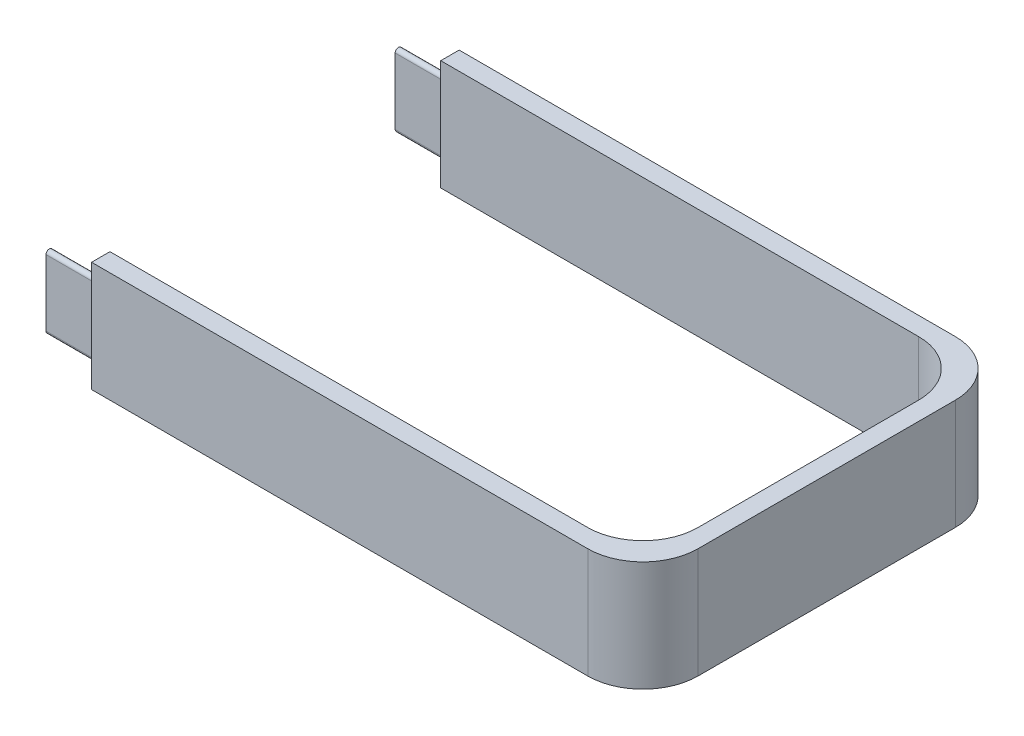
ISO-10303-21;
HEADER;
FILE_DESCRIPTION(('STEP AP214'),'2;1');
FILE_NAME('part.step','',(''),(''),'','','');
FILE_SCHEMA(('AUTOMOTIVE_DESIGN { 1 0 10303 214 1 1 1 1 }'));
ENDSEC;
DATA;
#1=APPLICATION_CONTEXT('core data for automotive mechanical design processes');
#2=APPLICATION_PROTOCOL_DEFINITION('international standard','automotive_design',2000,#1);
#3=PRODUCT_CONTEXT('',#1,'mechanical');
#4=PRODUCT('Part','Part','',(#3));
#5=PRODUCT_RELATED_PRODUCT_CATEGORY('part','',(#4));
#6=PRODUCT_DEFINITION_FORMATION('','',#4);
#7=PRODUCT_DEFINITION_CONTEXT('part definition',#1,'design');
#8=PRODUCT_DEFINITION('design','',#6,#7);
#9=PRODUCT_DEFINITION_SHAPE('','',#8);
#10=(LENGTH_UNIT() NAMED_UNIT(*) SI_UNIT(.MILLI.,.METRE.));
#11=(NAMED_UNIT(*) PLANE_ANGLE_UNIT() SI_UNIT($,.RADIAN.));
#12=(NAMED_UNIT(*) SI_UNIT($,.STERADIAN.) SOLID_ANGLE_UNIT());
#13=UNCERTAINTY_MEASURE_WITH_UNIT(LENGTH_MEASURE(1.E-05),#10,'distance_accuracy_value','');
#14=(GEOMETRIC_REPRESENTATION_CONTEXT(3) GLOBAL_UNCERTAINTY_ASSIGNED_CONTEXT((#13)) GLOBAL_UNIT_ASSIGNED_CONTEXT((#10,
#11,#12)) REPRESENTATION_CONTEXT('',''));
#15=CARTESIAN_POINT('',(0.,0.,0.));
#16=DIRECTION('',(0.,0.,1.));
#17=DIRECTION('',(1.,0.,0.));
#18=AXIS2_PLACEMENT_3D('',#15,#16,#17);
#19=CARTESIAN_POINT('',(2.5,30.,-97.5));
#20=DIRECTION('',(0.,-1.,0.));
#21=DIRECTION('',(0.,0.,-1.));
#22=AXIS2_PLACEMENT_3D('',#19,#20,#21);
#23=PLANE('',#22);
#24=DIRECTION('',(0.,0.,-1.));
#25=VECTOR('',#24,1.);
#26=CARTESIAN_POINT('',(170.,30.,-97.5));
#27=LINE('',#26,#25);
#28=CARTESIAN_POINT('',(170.,30.,0.));
#29=VERTEX_POINT('',#28);
#30=CARTESIAN_POINT('',(170.,30.,-5.));
#31=VERTEX_POINT('',#30);
#32=EDGE_CURVE('E310',#29,#31,#27,.T.);
#33=ORIENTED_EDGE('',*,*,#32,.F.);
#34=DIRECTION('',(1.,0.,0.));
#35=VECTOR('',#34,1.);
#36=CARTESIAN_POINT('',(0.,30.,0.));
#37=LINE('',#36,#35);
#38=CARTESIAN_POINT('',(305.,30.,0.));
#39=VERTEX_POINT('',#38);
#40=EDGE_CURVE('E398',#29,#39,#37,.T.);
#41=ORIENTED_EDGE('',*,*,#40,.T.);
#42=CARTESIAN_POINT('',(305.,30.,-15.));
#43=DIRECTION('',(0.,1.,0.));
#44=DIRECTION('',(0.,0.,1.));
#45=AXIS2_PLACEMENT_3D('',#42,#43,#44);
#46=CIRCLE('',#45,15.);
#47=CARTESIAN_POINT('',(320.,30.,-15.0000000000001));
#48=VERTEX_POINT('',#47);
#49=EDGE_CURVE('E401',#39,#48,#46,.T.);
#50=ORIENTED_EDGE('',*,*,#49,.T.);
#51=DIRECTION('',(0.,0.,-1.));
#52=VECTOR('',#51,1.);
#53=CARTESIAN_POINT('',(320.,30.,-15.0000000000001));
#54=LINE('',#53,#52);
#55=CARTESIAN_POINT('',(320.,30.,-84.9999999999999));
#56=VERTEX_POINT('',#55);
#57=EDGE_CURVE('E405',#48,#56,#54,.T.);
#58=ORIENTED_EDGE('',*,*,#57,.T.);
#59=CARTESIAN_POINT('',(305.,30.,-85.));
#60=DIRECTION('',(0.,1.,0.));
#61=DIRECTION('',(0.,0.,1.));
#62=AXIS2_PLACEMENT_3D('',#59,#60,#61);
#63=CIRCLE('',#62,15.);
#64=CARTESIAN_POINT('',(305.,30.,-100.));
#65=VERTEX_POINT('',#64);
#66=EDGE_CURVE('E408',#56,#65,#63,.T.);
#67=ORIENTED_EDGE('',*,*,#66,.T.);
#68=DIRECTION('',(-1.,0.,0.));
#69=VECTOR('',#68,1.);
#70=CARTESIAN_POINT('',(2.50000000000002,30.,-100.));
#71=LINE('',#70,#69);
#72=CARTESIAN_POINT('',(170.,30.,-100.));
#73=VERTEX_POINT('',#72);
#74=EDGE_CURVE('E411',#65,#73,#71,.T.);
#75=ORIENTED_EDGE('',*,*,#74,.T.);
#76=CARTESIAN_POINT('',(170.,30.,-95.));
#77=VERTEX_POINT('',#76);
#78=EDGE_CURVE('E306',#77,#73,#27,.T.);
#79=ORIENTED_EDGE('',*,*,#78,.F.);
#80=DIRECTION('',(-1.,0.,0.));
#81=VECTOR('',#80,1.);
#82=CARTESIAN_POINT('',(20.0000000000001,30.,-95.));
#83=LINE('',#82,#81);
#84=CARTESIAN_POINT('',(300.,30.,-95.));
#85=VERTEX_POINT('',#84);
#86=EDGE_CURVE('E361',#85,#77,#83,.T.);
#87=ORIENTED_EDGE('',*,*,#86,.F.);
#88=CARTESIAN_POINT('',(300.,30.,-80.));
#89=DIRECTION('',(0.,1.,0.));
#90=DIRECTION('',(0.,0.,-1.));
#91=AXIS2_PLACEMENT_3D('',#88,#89,#90);
#92=CIRCLE('',#91,15.);
#93=CARTESIAN_POINT('',(315.,30.,-79.9999999999999));
#94=VERTEX_POINT('',#93);
#95=EDGE_CURVE('E358',#94,#85,#92,.T.);
#96=ORIENTED_EDGE('',*,*,#95,.F.);
#97=DIRECTION('',(0.,0.,-1.));
#98=VECTOR('',#97,1.);
#99=CARTESIAN_POINT('',(315.,30.,-79.9999999999999));
#100=LINE('',#99,#98);
#101=CARTESIAN_POINT('',(315.,30.,-20.0000000000001));
#102=VERTEX_POINT('',#101);
#103=EDGE_CURVE('E355',#102,#94,#100,.T.);
#104=ORIENTED_EDGE('',*,*,#103,.F.);
#105=CARTESIAN_POINT('',(300.,30.,-20.));
#106=DIRECTION('',(0.,1.,0.));
#107=DIRECTION('',(0.,0.,-1.));
#108=AXIS2_PLACEMENT_3D('',#105,#106,#107);
#109=CIRCLE('',#108,15.);
#110=CARTESIAN_POINT('',(300.,30.,-5.));
#111=VERTEX_POINT('',#110);
#112=EDGE_CURVE('E351',#111,#102,#109,.T.);
#113=ORIENTED_EDGE('',*,*,#112,.F.);
#114=DIRECTION('',(1.,0.,0.));
#115=VECTOR('',#114,1.);
#116=CARTESIAN_POINT('',(20.0000000000001,30.,-5.));
#117=LINE('',#116,#115);
#118=EDGE_CURVE('E348',#31,#111,#117,.T.);
#119=ORIENTED_EDGE('',*,*,#118,.F.);
#120=EDGE_LOOP('',(#33,#41,#50,#58,#67,#75,#79,#87,#96,#104,#113,#119));
#121=FACE_BOUND('',#120,.T.);
#122=ADVANCED_FACE('F45',(#121),#23,.F.);
#123=CARTESIAN_POINT('',(2.5,0.,-97.5));
#124=DIRECTION('',(0.,-1.,0.));
#125=DIRECTION('',(0.,0.,-1.));
#126=AXIS2_PLACEMENT_3D('',#123,#124,#125);
#127=PLANE('',#126);
#128=DIRECTION('',(1.,0.,0.));
#129=VECTOR('',#128,1.);
#130=CARTESIAN_POINT('',(0.,0.,0.));
#131=LINE('',#130,#129);
#132=CARTESIAN_POINT('',(170.,0.,0.));
#133=VERTEX_POINT('',#132);
#134=CARTESIAN_POINT('',(305.,0.,0.));
#135=VERTEX_POINT('',#134);
#136=EDGE_CURVE('E397',#133,#135,#131,.T.);
#137=ORIENTED_EDGE('',*,*,#136,.F.);
#138=DIRECTION('',(0.,0.,-1.));
#139=VECTOR('',#138,1.);
#140=CARTESIAN_POINT('',(170.,0.,0.));
#141=LINE('',#140,#139);
#142=CARTESIAN_POINT('',(170.,0.,-5.));
#143=VERTEX_POINT('',#142);
#144=EDGE_CURVE('E295',#133,#143,#141,.T.);
#145=ORIENTED_EDGE('',*,*,#144,.T.);
#146=DIRECTION('',(1.,0.,0.));
#147=VECTOR('',#146,1.);
#148=CARTESIAN_POINT('',(20.0000000000001,0.,-5.));
#149=LINE('',#148,#147);
#150=CARTESIAN_POINT('',(300.,0.,-5.));
#151=VERTEX_POINT('',#150);
#152=EDGE_CURVE('E340',#143,#151,#149,.T.);
#153=ORIENTED_EDGE('',*,*,#152,.T.);
#154=CARTESIAN_POINT('',(300.,0.,-20.));
#155=DIRECTION('',(0.,1.,0.));
#156=DIRECTION('',(0.,0.,-1.));
#157=AXIS2_PLACEMENT_3D('',#154,#155,#156);
#158=CIRCLE('',#157,15.);
#159=CARTESIAN_POINT('',(315.,0.,-20.0000000000001));
#160=VERTEX_POINT('',#159);
#161=EDGE_CURVE('E368',#151,#160,#158,.T.);
#162=ORIENTED_EDGE('',*,*,#161,.T.);
#163=DIRECTION('',(0.,0.,-1.));
#164=VECTOR('',#163,1.);
#165=CARTESIAN_POINT('',(315.,0.,-79.9999999999999));
#166=LINE('',#165,#164);
#167=CARTESIAN_POINT('',(315.,0.,-40.));
#168=VERTEX_POINT('',#167);
#169=EDGE_CURVE('E373',#160,#168,#166,.T.);
#170=ORIENTED_EDGE('',*,*,#169,.T.);
#171=DIRECTION('',(0.,0.,1.));
#172=VECTOR('',#171,1.);
#173=CARTESIAN_POINT('',(315.,0.,-60.));
#174=LINE('',#173,#172);
#175=CARTESIAN_POINT('',(315.,0.,-60.));
#176=VERTEX_POINT('',#175);
#177=EDGE_CURVE('E336',#176,#168,#174,.T.);
#178=ORIENTED_EDGE('',*,*,#177,.F.);
#179=CARTESIAN_POINT('',(315.,0.,-79.9999999999999));
#180=VERTEX_POINT('',#179);
#181=EDGE_CURVE('E372',#176,#180,#166,.T.);
#182=ORIENTED_EDGE('',*,*,#181,.T.);
#183=CARTESIAN_POINT('',(300.,0.,-80.));
#184=DIRECTION('',(0.,1.,0.));
#185=DIRECTION('',(0.,0.,-1.));
#186=AXIS2_PLACEMENT_3D('',#183,#184,#185);
#187=CIRCLE('',#186,15.);
#188=CARTESIAN_POINT('',(300.,0.,-95.));
#189=VERTEX_POINT('',#188);
#190=EDGE_CURVE('E377',#180,#189,#187,.T.);
#191=ORIENTED_EDGE('',*,*,#190,.T.);
#192=DIRECTION('',(-1.,0.,0.));
#193=VECTOR('',#192,1.);
#194=CARTESIAN_POINT('',(20.0000000000001,0.,-95.));
#195=LINE('',#194,#193);
#196=CARTESIAN_POINT('',(170.,0.,-95.));
#197=VERTEX_POINT('',#196);
#198=EDGE_CURVE('E352',#189,#197,#195,.T.);
#199=ORIENTED_EDGE('',*,*,#198,.T.);
#200=CARTESIAN_POINT('',(170.,0.,-100.));
#201=VERTEX_POINT('',#200);
#202=EDGE_CURVE('E283',#197,#201,#141,.T.);
#203=ORIENTED_EDGE('',*,*,#202,.T.);
#204=DIRECTION('',(-1.,0.,0.));
#205=VECTOR('',#204,1.);
#206=CARTESIAN_POINT('',(2.50000000000002,0.,-100.));
#207=LINE('',#206,#205);
#208=CARTESIAN_POINT('',(305.,0.,-100.));
#209=VERTEX_POINT('',#208);
#210=EDGE_CURVE('E402',#209,#201,#207,.T.);
#211=ORIENTED_EDGE('',*,*,#210,.F.);
#212=CARTESIAN_POINT('',(305.,0.,-85.));
#213=DIRECTION('',(0.,1.,0.));
#214=DIRECTION('',(0.,0.,1.));
#215=AXIS2_PLACEMENT_3D('',#212,#213,#214);
#216=CIRCLE('',#215,15.);
#217=CARTESIAN_POINT('',(320.,0.,-84.9999999999999));
#218=VERTEX_POINT('',#217);
#219=EDGE_CURVE('E424',#218,#209,#216,.T.);
#220=ORIENTED_EDGE('',*,*,#219,.F.);
#221=DIRECTION('',(0.,0.,-1.));
#222=VECTOR('',#221,1.);
#223=CARTESIAN_POINT('',(320.,0.,-15.0000000000001));
#224=LINE('',#223,#222);
#225=CARTESIAN_POINT('',(320.,0.,-15.0000000000001));
#226=VERTEX_POINT('',#225);
#227=EDGE_CURVE('E421',#226,#218,#224,.T.);
#228=ORIENTED_EDGE('',*,*,#227,.F.);
#229=CARTESIAN_POINT('',(305.,0.,-15.));
#230=DIRECTION('',(0.,1.,0.));
#231=DIRECTION('',(0.,0.,1.));
#232=AXIS2_PLACEMENT_3D('',#229,#230,#231);
#233=CIRCLE('',#232,15.);
#234=EDGE_CURVE('E418',#135,#226,#233,.T.);
#235=ORIENTED_EDGE('',*,*,#234,.F.);
#236=EDGE_LOOP('',(#137,#145,#153,#162,#170,#178,#182,#191,#199,#203,#211,#220,#228,#235));
#237=FACE_BOUND('',#236,.T.);
#238=ADVANCED_FACE('F453',(#237),#127,.T.);
#239=CARTESIAN_POINT('',(0.,30.,0.));
#240=DIRECTION('',(0.,0.,-1.));
#241=DIRECTION('',(-1.,0.,0.));
#242=AXIS2_PLACEMENT_3D('',#239,#240,#241);
#243=PLANE('',#242);
#244=DIRECTION('',(0.,-1.,0.));
#245=VECTOR('',#244,1.);
#246=CARTESIAN_POINT('',(170.,40.,0.));
#247=LINE('',#246,#245);
#248=EDGE_CURVE('E302',#29,#133,#247,.T.);
#249=ORIENTED_EDGE('',*,*,#248,.T.);
#250=ORIENTED_EDGE('',*,*,#136,.T.);
#251=DIRECTION('',(0.,-1.,0.));
#252=VECTOR('',#251,1.);
#253=CARTESIAN_POINT('',(305.,30.,0.));
#254=LINE('',#253,#252);
#255=EDGE_CURVE('E54',#39,#135,#254,.T.);
#256=ORIENTED_EDGE('',*,*,#255,.F.);
#257=ORIENTED_EDGE('',*,*,#40,.F.);
#258=EDGE_LOOP('',(#249,#250,#256,#257));
#259=FACE_BOUND('',#258,.T.);
#260=ADVANCED_FACE('F47',(#259),#243,.F.);
#261=CARTESIAN_POINT('',(2.50000000000002,30.,-100.));
#262=DIRECTION('',(0.,0.,1.));
#263=DIRECTION('',(1.,0.,0.));
#264=AXIS2_PLACEMENT_3D('',#261,#262,#263);
#265=PLANE('',#264);
#266=DIRECTION('',(0.,-1.,0.));
#267=VECTOR('',#266,1.);
#268=CARTESIAN_POINT('',(170.,40.,-100.));
#269=LINE('',#268,#267);
#270=EDGE_CURVE('E299',#73,#201,#269,.T.);
#271=ORIENTED_EDGE('',*,*,#270,.F.);
#272=ORIENTED_EDGE('',*,*,#74,.F.);
#273=DIRECTION('',(0.,-1.,0.));
#274=VECTOR('',#273,1.);
#275=CARTESIAN_POINT('',(305.,30.,-100.));
#276=LINE('',#275,#274);
#277=EDGE_CURVE('E415',#65,#209,#276,.T.);
#278=ORIENTED_EDGE('',*,*,#277,.T.);
#279=ORIENTED_EDGE('',*,*,#210,.T.);
#280=EDGE_LOOP('',(#271,#272,#278,#279));
#281=FACE_BOUND('',#280,.T.);
#282=ADVANCED_FACE('F509',(#281),#265,.F.);
#283=CARTESIAN_POINT('',(20.0000000000001,30.,-5.));
#284=DIRECTION('',(0.,0.,-1.));
#285=DIRECTION('',(-1.,0.,0.));
#286=AXIS2_PLACEMENT_3D('',#283,#284,#285);
#287=PLANE('',#286);
#288=ORIENTED_EDGE('',*,*,#152,.F.);
#289=DIRECTION('',(0.,1.,0.));
#290=VECTOR('',#289,1.);
#291=CARTESIAN_POINT('',(170.,30.,-5.));
#292=LINE('',#291,#290);
#293=EDGE_CURVE('E309',#143,#31,#292,.T.);
#294=ORIENTED_EDGE('',*,*,#293,.T.);
#295=ORIENTED_EDGE('',*,*,#118,.T.);
#296=DIRECTION('',(0.,-1.,0.));
#297=VECTOR('',#296,1.);
#298=CARTESIAN_POINT('',(300.,30.,-5.));
#299=LINE('',#298,#297);
#300=EDGE_CURVE('E393',#111,#151,#299,.T.);
#301=ORIENTED_EDGE('',*,*,#300,.T.);
#302=EDGE_LOOP('',(#288,#294,#295,#301));
#303=FACE_BOUND('',#302,.T.);
#304=ADVANCED_FACE('F473',(#303),#287,.T.);
#305=CARTESIAN_POINT('',(20.0000000000001,30.,-95.));
#306=DIRECTION('',(0.,0.,1.));
#307=DIRECTION('',(1.,0.,0.));
#308=AXIS2_PLACEMENT_3D('',#305,#306,#307);
#309=PLANE('',#308);
#310=ORIENTED_EDGE('',*,*,#86,.T.);
#311=DIRECTION('',(0.,-1.,0.));
#312=VECTOR('',#311,1.);
#313=CARTESIAN_POINT('',(170.,30.,-95.));
#314=LINE('',#313,#312);
#315=EDGE_CURVE('E11',#77,#197,#314,.T.);
#316=ORIENTED_EDGE('',*,*,#315,.T.);
#317=ORIENTED_EDGE('',*,*,#198,.F.);
#318=DIRECTION('',(0.,-1.,0.));
#319=VECTOR('',#318,1.);
#320=CARTESIAN_POINT('',(300.,30.,-95.));
#321=LINE('',#320,#319);
#322=EDGE_CURVE('E365',#85,#189,#321,.T.);
#323=ORIENTED_EDGE('',*,*,#322,.F.);
#324=EDGE_LOOP('',(#310,#316,#317,#323));
#325=FACE_BOUND('',#324,.T.);
#326=ADVANCED_FACE('F515',(#325),#309,.T.);
#327=CARTESIAN_POINT('',(305.,30.,-15.));
#328=DIRECTION('',(0.,-1.,0.));
#329=DIRECTION('',(0.,0.,-1.));
#330=AXIS2_PLACEMENT_3D('',#327,#328,#329);
#331=CYLINDRICAL_SURFACE('',#330,15.);
#332=ORIENTED_EDGE('',*,*,#234,.T.);
#333=DIRECTION('',(0.,-1.,0.));
#334=VECTOR('',#333,1.);
#335=CARTESIAN_POINT('',(320.,30.,-15.0000000000001));
#336=LINE('',#335,#334);
#337=EDGE_CURVE('E437',#48,#226,#336,.T.);
#338=ORIENTED_EDGE('',*,*,#337,.F.);
#339=ORIENTED_EDGE('',*,*,#49,.F.);
#340=ORIENTED_EDGE('',*,*,#255,.T.);
#341=EDGE_LOOP('',(#332,#338,#339,#340));
#342=FACE_BOUND('',#341,.T.);
#343=ADVANCED_FACE('F446',(#342),#331,.T.);
#344=CARTESIAN_POINT('',(320.,30.,-15.0000000000001));
#345=DIRECTION('',(-1.,0.,0.));
#346=DIRECTION('',(0.,0.,1.));
#347=AXIS2_PLACEMENT_3D('',#344,#345,#346);
#348=PLANE('',#347);
#349=ORIENTED_EDGE('',*,*,#227,.T.);
#350=DIRECTION('',(0.,-1.,0.));
#351=VECTOR('',#350,1.);
#352=CARTESIAN_POINT('',(320.,30.,-84.9999999999999));
#353=LINE('',#352,#351);
#354=EDGE_CURVE('E433',#56,#218,#353,.T.);
#355=ORIENTED_EDGE('',*,*,#354,.F.);
#356=ORIENTED_EDGE('',*,*,#57,.F.);
#357=ORIENTED_EDGE('',*,*,#337,.T.);
#358=EDGE_LOOP('',(#349,#355,#356,#357));
#359=FACE_BOUND('',#358,.T.);
#360=ADVANCED_FACE('F458',(#359),#348,.F.);
#361=CARTESIAN_POINT('',(305.,30.,-85.));
#362=DIRECTION('',(0.,-1.,0.));
#363=DIRECTION('',(0.,0.,-1.));
#364=AXIS2_PLACEMENT_3D('',#361,#362,#363);
#365=CYLINDRICAL_SURFACE('',#364,15.);
#366=ORIENTED_EDGE('',*,*,#219,.T.);
#367=ORIENTED_EDGE('',*,*,#277,.F.);
#368=ORIENTED_EDGE('',*,*,#66,.F.);
#369=ORIENTED_EDGE('',*,*,#354,.T.);
#370=EDGE_LOOP('',(#366,#367,#368,#369));
#371=FACE_BOUND('',#370,.T.);
#372=ADVANCED_FACE('F462',(#371),#365,.T.);
#373=CARTESIAN_POINT('',(300.,30.,-20.));
#374=DIRECTION('',(0.,-1.,0.));
#375=DIRECTION('',(0.,0.,-1.));
#376=AXIS2_PLACEMENT_3D('',#373,#374,#375);
#377=CYLINDRICAL_SURFACE('',#376,15.);
#378=ORIENTED_EDGE('',*,*,#161,.F.);
#379=ORIENTED_EDGE('',*,*,#300,.F.);
#380=ORIENTED_EDGE('',*,*,#112,.T.);
#381=DIRECTION('',(0.,-1.,0.));
#382=VECTOR('',#381,1.);
#383=CARTESIAN_POINT('',(315.,30.,-20.0000000000001));
#384=LINE('',#383,#382);
#385=EDGE_CURVE('E390',#102,#160,#384,.T.);
#386=ORIENTED_EDGE('',*,*,#385,.T.);
#387=EDGE_LOOP('',(#378,#379,#380,#386));
#388=FACE_BOUND('',#387,.T.);
#389=ADVANCED_FACE('F478',(#388),#377,.F.);
#390=CARTESIAN_POINT('',(315.,30.,-79.9999999999999));
#391=DIRECTION('',(-1.,0.,0.));
#392=DIRECTION('',(0.,0.,1.));
#393=AXIS2_PLACEMENT_3D('',#390,#391,#392);
#394=PLANE('',#393);
#395=DIRECTION('',(0.,1.,0.));
#396=VECTOR('',#395,1.);
#397=CARTESIAN_POINT('',(315.,0.,-60.));
#398=LINE('',#397,#396);
#399=CARTESIAN_POINT('',(315.,5.,-60.));
#400=VERTEX_POINT('',#399);
#401=EDGE_CURVE('E328',#176,#400,#398,.T.);
#402=ORIENTED_EDGE('',*,*,#401,.T.);
#403=DIRECTION('',(0.,0.,1.));
#404=VECTOR('',#403,1.);
#405=CARTESIAN_POINT('',(315.,5.,-60.));
#406=LINE('',#405,#404);
#407=CARTESIAN_POINT('',(315.,5.,-40.));
#408=VERTEX_POINT('',#407);
#409=EDGE_CURVE('E341',#400,#408,#406,.T.);
#410=ORIENTED_EDGE('',*,*,#409,.T.);
#411=DIRECTION('',(0.,1.,0.));
#412=VECTOR('',#411,1.);
#413=CARTESIAN_POINT('',(315.,0.,-40.));
#414=LINE('',#413,#412);
#415=EDGE_CURVE('E317',#168,#408,#414,.T.);
#416=ORIENTED_EDGE('',*,*,#415,.F.);
#417=ORIENTED_EDGE('',*,*,#169,.F.);
#418=ORIENTED_EDGE('',*,*,#385,.F.);
#419=ORIENTED_EDGE('',*,*,#103,.T.);
#420=DIRECTION('',(0.,-1.,0.));
#421=VECTOR('',#420,1.);
#422=CARTESIAN_POINT('',(315.,30.,-79.9999999999999));
#423=LINE('',#422,#421);
#424=EDGE_CURVE('E386',#94,#180,#423,.T.);
#425=ORIENTED_EDGE('',*,*,#424,.T.);
#426=ORIENTED_EDGE('',*,*,#181,.F.);
#427=EDGE_LOOP('',(#402,#410,#416,#417,#418,#419,#425,#426));
#428=FACE_BOUND('',#427,.T.);
#429=ADVANCED_FACE('F484',(#428),#394,.T.);
#430=CARTESIAN_POINT('',(300.,30.,-80.));
#431=DIRECTION('',(0.,-1.,0.));
#432=DIRECTION('',(0.,0.,-1.));
#433=AXIS2_PLACEMENT_3D('',#430,#431,#432);
#434=CYLINDRICAL_SURFACE('',#433,15.);
#435=ORIENTED_EDGE('',*,*,#190,.F.);
#436=ORIENTED_EDGE('',*,*,#424,.F.);
#437=ORIENTED_EDGE('',*,*,#95,.T.);
#438=ORIENTED_EDGE('',*,*,#322,.T.);
#439=EDGE_LOOP('',(#435,#436,#437,#438));
#440=FACE_BOUND('',#439,.T.);
#441=ADVANCED_FACE('F517',(#440),#434,.F.);
#442=CARTESIAN_POINT('',(312.5,2.5,-60.));
#443=DIRECTION('',(-0.707106781186547,-0.707106781186548,0.));
#444=DIRECTION('',(0.707106781186548,-0.707106781186547,0.));
#445=AXIS2_PLACEMENT_3D('',#442,#443,#444);
#446=PLANE('',#445);
#447=ORIENTED_EDGE('',*,*,#177,.T.);
#448=DIRECTION('',(0.707106781186548,-0.707106781186547,0.));
#449=VECTOR('',#448,1.);
#450=CARTESIAN_POINT('',(312.5,2.5,-40.));
#451=LINE('',#450,#449);
#452=CARTESIAN_POINT('',(312.5,2.5,-40.));
#453=VERTEX_POINT('',#452);
#454=EDGE_CURVE('E314',#453,#168,#451,.T.);
#455=ORIENTED_EDGE('',*,*,#454,.F.);
#456=DIRECTION('',(0.,0.,1.));
#457=VECTOR('',#456,1.);
#458=CARTESIAN_POINT('',(312.5,2.5,-60.));
#459=LINE('',#458,#457);
#460=CARTESIAN_POINT('',(312.5,2.5,-60.));
#461=VERTEX_POINT('',#460);
#462=EDGE_CURVE('E337',#461,#453,#459,.T.);
#463=ORIENTED_EDGE('',*,*,#462,.F.);
#464=DIRECTION('',(0.707106781186548,-0.707106781186547,0.));
#465=VECTOR('',#464,1.);
#466=CARTESIAN_POINT('',(312.5,2.5,-60.));
#467=LINE('',#466,#465);
#468=EDGE_CURVE('E324',#461,#176,#467,.T.);
#469=ORIENTED_EDGE('',*,*,#468,.T.);
#470=EDGE_LOOP('',(#447,#455,#463,#469));
#471=FACE_BOUND('',#470,.T.);
#472=ADVANCED_FACE('F495',(#471),#446,.T.);
#473=CARTESIAN_POINT('',(315.,5.,-60.));
#474=DIRECTION('',(-0.707106781186547,0.707106781186548,0.));
#475=DIRECTION('',(-0.707106781186548,-0.707106781186547,0.));
#476=AXIS2_PLACEMENT_3D('',#473,#474,#475);
#477=PLANE('',#476);
#478=ORIENTED_EDGE('',*,*,#462,.T.);
#479=DIRECTION('',(-0.707106781186548,-0.707106781186547,0.));
#480=VECTOR('',#479,1.);
#481=CARTESIAN_POINT('',(315.,5.,-40.));
#482=LINE('',#481,#480);
#483=EDGE_CURVE('E320',#408,#453,#482,.T.);
#484=ORIENTED_EDGE('',*,*,#483,.F.);
#485=ORIENTED_EDGE('',*,*,#409,.F.);
#486=DIRECTION('',(-0.707106781186548,-0.707106781186547,0.));
#487=VECTOR('',#486,1.);
#488=CARTESIAN_POINT('',(315.,5.,-60.));
#489=LINE('',#488,#487);
#490=EDGE_CURVE('E332',#400,#461,#489,.T.);
#491=ORIENTED_EDGE('',*,*,#490,.T.);
#492=EDGE_LOOP('',(#478,#484,#485,#491));
#493=FACE_BOUND('',#492,.T.);
#494=ADVANCED_FACE('F491',(#493),#477,.T.);
#495=CARTESIAN_POINT('',(0.,0.,-60.));
#496=DIRECTION('',(0.,0.,-1.));
#497=DIRECTION('',(-1.,0.,0.));
#498=AXIS2_PLACEMENT_3D('',#495,#496,#497);
#499=PLANE('',#498);
#500=ORIENTED_EDGE('',*,*,#468,.F.);
#501=ORIENTED_EDGE('',*,*,#490,.F.);
#502=ORIENTED_EDGE('',*,*,#401,.F.);
#503=EDGE_LOOP('',(#500,#501,#502));
#504=FACE_BOUND('',#503,.T.);
#505=ADVANCED_FACE('F498',(#504),#499,.T.);
#506=CARTESIAN_POINT('',(0.,0.,-40.));
#507=DIRECTION('',(0.,0.,-1.));
#508=DIRECTION('',(-1.,0.,0.));
#509=AXIS2_PLACEMENT_3D('',#506,#507,#508);
#510=PLANE('',#509);
#511=ORIENTED_EDGE('',*,*,#454,.T.);
#512=ORIENTED_EDGE('',*,*,#415,.T.);
#513=ORIENTED_EDGE('',*,*,#483,.T.);
#514=EDGE_LOOP('',(#511,#512,#513));
#515=FACE_BOUND('',#514,.T.);
#516=ADVANCED_FACE('F488',(#515),#510,.F.);
#517=CARTESIAN_POINT('',(170.,40.,0.));
#518=DIRECTION('',(-1.,0.,0.));
#519=DIRECTION('',(0.,0.,1.));
#520=AXIS2_PLACEMENT_3D('',#517,#518,#519);
#521=PLANE('',#520);
#522=DIRECTION('',(0.,1.,0.));
#523=VECTOR('',#522,1.);
#524=CARTESIAN_POINT('',(170.,0.,-98.4));
#525=LINE('',#524,#523);
#526=CARTESIAN_POINT('',(170.,6.,-98.4));
#527=VERTEX_POINT('',#526);
#528=CARTESIAN_POINT('',(170.,24.,-98.4));
#529=VERTEX_POINT('',#528);
#530=EDGE_CURVE('E245',#527,#529,#525,.T.);
#531=ORIENTED_EDGE('',*,*,#530,.T.);
#532=CARTESIAN_POINT('',(170.,24.,-97.5));
#533=DIRECTION('',(1.,0.,0.));
#534=DIRECTION('',(0.,0.,-1.));
#535=AXIS2_PLACEMENT_3D('',#532,#533,#534);
#536=CIRCLE('',#535,0.899999999999998);
#537=CARTESIAN_POINT('',(170.,24.,-96.6));
#538=VERTEX_POINT('',#537);
#539=EDGE_CURVE('E270',#529,#538,#536,.T.);
#540=ORIENTED_EDGE('',*,*,#539,.T.);
#541=DIRECTION('',(0.,1.,0.));
#542=VECTOR('',#541,1.);
#543=CARTESIAN_POINT('',(170.,0.,-96.6));
#544=LINE('',#543,#542);
#545=CARTESIAN_POINT('',(170.,6.,-96.6));
#546=VERTEX_POINT('',#545);
#547=EDGE_CURVE('E273',#546,#538,#544,.T.);
#548=ORIENTED_EDGE('',*,*,#547,.F.);
#549=CARTESIAN_POINT('',(170.,6.,-97.5));
#550=DIRECTION('',(1.,0.,0.));
#551=DIRECTION('',(0.,0.,-1.));
#552=AXIS2_PLACEMENT_3D('',#549,#550,#551);
#553=CIRCLE('',#552,0.899999999999998);
#554=EDGE_CURVE('E256',#546,#527,#553,.T.);
#555=ORIENTED_EDGE('',*,*,#554,.T.);
#556=EDGE_LOOP('',(#531,#540,#548,#555));
#557=FACE_BOUND('',#556,.T.);
#558=ORIENTED_EDGE('',*,*,#78,.T.);
#559=ORIENTED_EDGE('',*,*,#270,.T.);
#560=ORIENTED_EDGE('',*,*,#202,.F.);
#561=ORIENTED_EDGE('',*,*,#315,.F.);
#562=EDGE_LOOP('',(#558,#559,#560,#561));
#563=FACE_BOUND('',#562,.T.);
#564=ADVANCED_FACE('F510',(#557,#563),#521,.T.);
#565=DIRECTION('',(0.,1.,0.));
#566=VECTOR('',#565,1.);
#567=CARTESIAN_POINT('',(170.,0.,-3.4));
#568=LINE('',#567,#566);
#569=CARTESIAN_POINT('',(170.,6.,-3.4));
#570=VERTEX_POINT('',#569);
#571=CARTESIAN_POINT('',(170.,24.,-3.4));
#572=VERTEX_POINT('',#571);
#573=EDGE_CURVE('E236',#570,#572,#568,.T.);
#574=ORIENTED_EDGE('',*,*,#573,.T.);
#575=CARTESIAN_POINT('',(170.,24.,-2.5));
#576=DIRECTION('',(1.,0.,0.));
#577=DIRECTION('',(0.,0.,-1.));
#578=AXIS2_PLACEMENT_3D('',#575,#576,#577);
#579=CIRCLE('',#578,0.9);
#580=CARTESIAN_POINT('',(170.,24.,-1.6));
#581=VERTEX_POINT('',#580);
#582=EDGE_CURVE('E206',#572,#581,#579,.T.);
#583=ORIENTED_EDGE('',*,*,#582,.T.);
#584=DIRECTION('',(0.,1.,0.));
#585=VECTOR('',#584,1.);
#586=CARTESIAN_POINT('',(170.,0.,-1.6));
#587=LINE('',#586,#585);
#588=CARTESIAN_POINT('',(170.,6.,-1.6));
#589=VERTEX_POINT('',#588);
#590=EDGE_CURVE('E66',#589,#581,#587,.T.);
#591=ORIENTED_EDGE('',*,*,#590,.F.);
#592=CARTESIAN_POINT('',(170.,6.,-2.5));
#593=DIRECTION('',(1.,0.,0.));
#594=DIRECTION('',(0.,0.,-1.));
#595=AXIS2_PLACEMENT_3D('',#592,#593,#594);
#596=CIRCLE('',#595,0.9);
#597=EDGE_CURVE('E61',#589,#570,#596,.T.);
#598=ORIENTED_EDGE('',*,*,#597,.T.);
#599=EDGE_LOOP('',(#574,#583,#591,#598));
#600=FACE_BOUND('',#599,.T.);
#601=ORIENTED_EDGE('',*,*,#32,.T.);
#602=ORIENTED_EDGE('',*,*,#293,.F.);
#603=ORIENTED_EDGE('',*,*,#144,.F.);
#604=ORIENTED_EDGE('',*,*,#248,.F.);
#605=EDGE_LOOP('',(#601,#602,#603,#604));
#606=FACE_BOUND('',#605,.T.);
#607=ADVANCED_FACE('F470',(#600,#606),#521,.T.);
#608=CARTESIAN_POINT('',(156.,0.,-98.4));
#609=DIRECTION('',(0.,0.,-1.));
#610=DIRECTION('',(-1.,0.,0.));
#611=AXIS2_PLACEMENT_3D('',#608,#609,#610);
#612=PLANE('',#611);
#613=ORIENTED_EDGE('',*,*,#530,.F.);
#614=DIRECTION('',(1.,0.,0.));
#615=VECTOR('',#614,1.);
#616=CARTESIAN_POINT('',(156.,6.,-98.4));
#617=LINE('',#616,#615);
#618=CARTESIAN_POINT('',(156.,6.,-98.4));
#619=VERTEX_POINT('',#618);
#620=EDGE_CURVE('E279',#619,#527,#617,.T.);
#621=ORIENTED_EDGE('',*,*,#620,.F.);
#622=DIRECTION('',(0.,1.,0.));
#623=VECTOR('',#622,1.);
#624=CARTESIAN_POINT('',(156.,0.,-98.4));
#625=LINE('',#624,#623);
#626=CARTESIAN_POINT('',(156.,24.,-98.4));
#627=VERTEX_POINT('',#626);
#628=EDGE_CURVE('E251',#619,#627,#625,.T.);
#629=ORIENTED_EDGE('',*,*,#628,.T.);
#630=DIRECTION('',(1.,0.,0.));
#631=VECTOR('',#630,1.);
#632=CARTESIAN_POINT('',(156.,24.,-98.4));
#633=LINE('',#632,#631);
#634=EDGE_CURVE('E267',#627,#529,#633,.T.);
#635=ORIENTED_EDGE('',*,*,#634,.T.);
#636=EDGE_LOOP('',(#613,#621,#629,#635));
#637=FACE_BOUND('',#636,.T.);
#638=ADVANCED_FACE('F557',(#637),#612,.T.);
#639=CARTESIAN_POINT('',(156.,6.,-97.5));
#640=DIRECTION('',(1.,0.,0.));
#641=DIRECTION('',(0.,0.,-1.));
#642=AXIS2_PLACEMENT_3D('',#639,#640,#641);
#643=CYLINDRICAL_SURFACE('',#642,0.899999999999998);
#644=ORIENTED_EDGE('',*,*,#554,.F.);
#645=DIRECTION('',(1.,0.,0.));
#646=VECTOR('',#645,1.);
#647=CARTESIAN_POINT('',(156.,6.,-96.6));
#648=LINE('',#647,#646);
#649=CARTESIAN_POINT('',(156.,6.,-96.6));
#650=VERTEX_POINT('',#649);
#651=EDGE_CURVE('E284',#650,#546,#648,.T.);
#652=ORIENTED_EDGE('',*,*,#651,.F.);
#653=CARTESIAN_POINT('',(156.,6.,-97.5));
#654=DIRECTION('',(1.,0.,0.));
#655=DIRECTION('',(0.,0.,-1.));
#656=AXIS2_PLACEMENT_3D('',#653,#654,#655);
#657=CIRCLE('',#656,0.899999999999998);
#658=EDGE_CURVE('E263',#650,#619,#657,.T.);
#659=ORIENTED_EDGE('',*,*,#658,.T.);
#660=ORIENTED_EDGE('',*,*,#620,.T.);
#661=EDGE_LOOP('',(#644,#652,#659,#660));
#662=FACE_BOUND('',#661,.T.);
#663=ADVANCED_FACE('F560',(#662),#643,.T.);
#664=CARTESIAN_POINT('',(156.,0.,-96.6));
#665=DIRECTION('',(0.,0.,-1.));
#666=DIRECTION('',(-1.,0.,0.));
#667=AXIS2_PLACEMENT_3D('',#664,#665,#666);
#668=PLANE('',#667);
#669=ORIENTED_EDGE('',*,*,#547,.T.);
#670=DIRECTION('',(1.,0.,0.));
#671=VECTOR('',#670,1.);
#672=CARTESIAN_POINT('',(156.,24.,-96.6));
#673=LINE('',#672,#671);
#674=CARTESIAN_POINT('',(156.,24.,-96.6));
#675=VERTEX_POINT('',#674);
#676=EDGE_CURVE('E288',#675,#538,#673,.T.);
#677=ORIENTED_EDGE('',*,*,#676,.F.);
#678=DIRECTION('',(0.,1.,0.));
#679=VECTOR('',#678,1.);
#680=CARTESIAN_POINT('',(156.,0.,-96.6));
#681=LINE('',#680,#679);
#682=EDGE_CURVE('E260',#650,#675,#681,.T.);
#683=ORIENTED_EDGE('',*,*,#682,.F.);
#684=ORIENTED_EDGE('',*,*,#651,.T.);
#685=EDGE_LOOP('',(#669,#677,#683,#684));
#686=FACE_BOUND('',#685,.T.);
#687=ADVANCED_FACE('F566',(#686),#668,.F.);
#688=CARTESIAN_POINT('',(156.,24.,-97.5));
#689=DIRECTION('',(1.,0.,0.));
#690=DIRECTION('',(0.,0.,-1.));
#691=AXIS2_PLACEMENT_3D('',#688,#689,#690);
#692=CYLINDRICAL_SURFACE('',#691,0.899999999999998);
#693=ORIENTED_EDGE('',*,*,#539,.F.);
#694=ORIENTED_EDGE('',*,*,#634,.F.);
#695=CARTESIAN_POINT('',(156.,24.,-97.5));
#696=DIRECTION('',(1.,0.,0.));
#697=DIRECTION('',(0.,0.,-1.));
#698=AXIS2_PLACEMENT_3D('',#695,#696,#697);
#699=CIRCLE('',#698,0.899999999999998);
#700=EDGE_CURVE('E255',#627,#675,#699,.T.);
#701=ORIENTED_EDGE('',*,*,#700,.T.);
#702=ORIENTED_EDGE('',*,*,#676,.T.);
#703=EDGE_LOOP('',(#693,#694,#701,#702));
#704=FACE_BOUND('',#703,.T.);
#705=ADVANCED_FACE('F562',(#704),#692,.T.);
#706=CARTESIAN_POINT('',(156.,0.,0.));
#707=DIRECTION('',(1.,0.,0.));
#708=DIRECTION('',(0.,0.,-1.));
#709=AXIS2_PLACEMENT_3D('',#706,#707,#708);
#710=PLANE('',#709);
#711=ORIENTED_EDGE('',*,*,#628,.F.);
#712=ORIENTED_EDGE('',*,*,#658,.F.);
#713=ORIENTED_EDGE('',*,*,#682,.T.);
#714=ORIENTED_EDGE('',*,*,#700,.F.);
#715=EDGE_LOOP('',(#711,#712,#713,#714));
#716=FACE_BOUND('',#715,.T.);
#717=ADVANCED_FACE('F565',(#716),#710,.F.);
#718=CARTESIAN_POINT('',(156.,0.,-3.4));
#719=DIRECTION('',(0.,0.,-1.));
#720=DIRECTION('',(0.,1.,0.));
#721=AXIS2_PLACEMENT_3D('',#718,#719,#720);
#722=PLANE('',#721);
#723=ORIENTED_EDGE('',*,*,#573,.F.);
#724=DIRECTION('',(1.,0.,0.));
#725=VECTOR('',#724,1.);
#726=CARTESIAN_POINT('',(156.,6.,-3.4));
#727=LINE('',#726,#725);
#728=CARTESIAN_POINT('',(156.,6.,-3.4));
#729=VERTEX_POINT('',#728);
#730=EDGE_CURVE('E226',#729,#570,#727,.T.);
#731=ORIENTED_EDGE('',*,*,#730,.F.);
#732=DIRECTION('',(0.,1.,0.));
#733=VECTOR('',#732,1.);
#734=CARTESIAN_POINT('',(156.,0.,-3.4));
#735=LINE('',#734,#733);
#736=CARTESIAN_POINT('',(156.,24.,-3.4));
#737=VERTEX_POINT('',#736);
#738=EDGE_CURVE('E218',#729,#737,#735,.T.);
#739=ORIENTED_EDGE('',*,*,#738,.T.);
#740=DIRECTION('',(1.,0.,0.));
#741=VECTOR('',#740,1.);
#742=CARTESIAN_POINT('',(156.,24.,-3.4));
#743=LINE('',#742,#741);
#744=EDGE_CURVE('E201',#737,#572,#743,.T.);
#745=ORIENTED_EDGE('',*,*,#744,.T.);
#746=EDGE_LOOP('',(#723,#731,#739,#745));
#747=FACE_BOUND('',#746,.T.);
#748=ADVANCED_FACE('F225',(#747),#722,.T.);
#749=CARTESIAN_POINT('',(156.,6.,-2.5));
#750=DIRECTION('',(1.,0.,0.));
#751=DIRECTION('',(0.,0.,-1.));
#752=AXIS2_PLACEMENT_3D('',#749,#750,#751);
#753=CYLINDRICAL_SURFACE('',#752,0.9);
#754=ORIENTED_EDGE('',*,*,#597,.F.);
#755=DIRECTION('',(1.,0.,0.));
#756=VECTOR('',#755,1.);
#757=CARTESIAN_POINT('',(156.,6.,-1.6));
#758=LINE('',#757,#756);
#759=CARTESIAN_POINT('',(156.,6.,-1.6));
#760=VERTEX_POINT('',#759);
#761=EDGE_CURVE('E246',#760,#589,#758,.T.);
#762=ORIENTED_EDGE('',*,*,#761,.F.);
#763=CARTESIAN_POINT('',(156.,6.,-2.5));
#764=DIRECTION('',(1.,0.,0.));
#765=DIRECTION('',(0.,0.,-1.));
#766=AXIS2_PLACEMENT_3D('',#763,#764,#765);
#767=CIRCLE('',#766,0.9);
#768=EDGE_CURVE('E212',#760,#729,#767,.T.);
#769=ORIENTED_EDGE('',*,*,#768,.T.);
#770=ORIENTED_EDGE('',*,*,#730,.T.);
#771=EDGE_LOOP('',(#754,#762,#769,#770));
#772=FACE_BOUND('',#771,.T.);
#773=ADVANCED_FACE('F579',(#772),#753,.T.);
#774=CARTESIAN_POINT('',(156.,0.,-1.6));
#775=DIRECTION('',(0.,0.,-1.));
#776=DIRECTION('',(0.,1.,0.));
#777=AXIS2_PLACEMENT_3D('',#774,#775,#776);
#778=PLANE('',#777);
#779=ORIENTED_EDGE('',*,*,#590,.T.);
#780=DIRECTION('',(1.,0.,0.));
#781=VECTOR('',#780,1.);
#782=CARTESIAN_POINT('',(156.,24.,-1.6));
#783=LINE('',#782,#781);
#784=CARTESIAN_POINT('',(156.,24.,-1.6));
#785=VERTEX_POINT('',#784);
#786=EDGE_CURVE('E211',#785,#581,#783,.T.);
#787=ORIENTED_EDGE('',*,*,#786,.F.);
#788=DIRECTION('',(0.,1.,0.));
#789=VECTOR('',#788,1.);
#790=CARTESIAN_POINT('',(156.,0.,-1.6));
#791=LINE('',#790,#789);
#792=EDGE_CURVE('E221',#760,#785,#791,.T.);
#793=ORIENTED_EDGE('',*,*,#792,.F.);
#794=ORIENTED_EDGE('',*,*,#761,.T.);
#795=EDGE_LOOP('',(#779,#787,#793,#794));
#796=FACE_BOUND('',#795,.T.);
#797=ADVANCED_FACE('F582',(#796),#778,.F.);
#798=CARTESIAN_POINT('',(156.,24.,-2.5));
#799=DIRECTION('',(1.,0.,0.));
#800=DIRECTION('',(0.,0.,-1.));
#801=AXIS2_PLACEMENT_3D('',#798,#799,#800);
#802=CYLINDRICAL_SURFACE('',#801,0.9);
#803=ORIENTED_EDGE('',*,*,#582,.F.);
#804=ORIENTED_EDGE('',*,*,#744,.F.);
#805=CARTESIAN_POINT('',(156.,24.,-2.5));
#806=DIRECTION('',(1.,0.,0.));
#807=DIRECTION('',(0.,0.,-1.));
#808=AXIS2_PLACEMENT_3D('',#805,#806,#807);
#809=CIRCLE('',#808,0.9);
#810=EDGE_CURVE('E205',#737,#785,#809,.T.);
#811=ORIENTED_EDGE('',*,*,#810,.T.);
#812=ORIENTED_EDGE('',*,*,#786,.T.);
#813=EDGE_LOOP('',(#803,#804,#811,#812));
#814=FACE_BOUND('',#813,.T.);
#815=ADVANCED_FACE('F203',(#814),#802,.T.);
#816=CARTESIAN_POINT('',(156.,0.,0.));
#817=DIRECTION('',(1.,0.,0.));
#818=DIRECTION('',(0.,0.,-1.));
#819=AXIS2_PLACEMENT_3D('',#816,#817,#818);
#820=PLANE('',#819);
#821=ORIENTED_EDGE('',*,*,#738,.F.);
#822=ORIENTED_EDGE('',*,*,#768,.F.);
#823=ORIENTED_EDGE('',*,*,#792,.T.);
#824=ORIENTED_EDGE('',*,*,#810,.F.);
#825=EDGE_LOOP('',(#821,#822,#823,#824));
#826=FACE_BOUND('',#825,.T.);
#827=ADVANCED_FACE('F216',(#826),#820,.F.);
#828=CLOSED_SHELL('',(#122,#238,#260,#282,#304,#326,#343,#360,#372,#389,#429,#441,#472,#494,
#505,#516,#564,#607,#638,#663,#687,#705,#717,#748,#773,#797,#815,#827));
#829=MANIFOLD_SOLID_BREP('B2',#828);
#830=ADVANCED_BREP_SHAPE_REPRESENTATION('',(#18,#829),#14);
#831=SHAPE_DEFINITION_REPRESENTATION(#9,#830);
ENDSEC;
END-ISO-10303-21;
